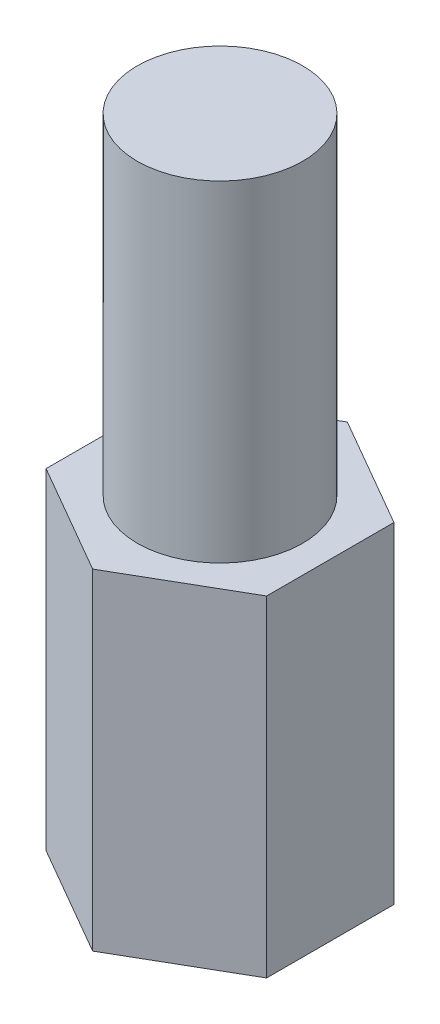
ISO-10303-21;
HEADER;
FILE_DESCRIPTION(('STEP AP214'),'2;1');
FILE_NAME('part.step','',(''),(''),'','','');
FILE_SCHEMA(('AUTOMOTIVE_DESIGN { 1 0 10303 214 1 1 1 1 }'));
ENDSEC;
DATA;
#1=APPLICATION_CONTEXT('core data for automotive mechanical design processes');
#2=APPLICATION_PROTOCOL_DEFINITION('international standard','automotive_design',2000,#1);
#3=PRODUCT_CONTEXT('',#1,'mechanical');
#4=PRODUCT('Part','Part','',(#3));
#5=PRODUCT_RELATED_PRODUCT_CATEGORY('part','',(#4));
#6=PRODUCT_DEFINITION_FORMATION('','',#4);
#7=PRODUCT_DEFINITION_CONTEXT('part definition',#1,'design');
#8=PRODUCT_DEFINITION('design','',#6,#7);
#9=PRODUCT_DEFINITION_SHAPE('','',#8);
#10=(LENGTH_UNIT() NAMED_UNIT(*) SI_UNIT(.MILLI.,.METRE.));
#11=(NAMED_UNIT(*) PLANE_ANGLE_UNIT() SI_UNIT($,.RADIAN.));
#12=(NAMED_UNIT(*) SI_UNIT($,.STERADIAN.) SOLID_ANGLE_UNIT());
#13=UNCERTAINTY_MEASURE_WITH_UNIT(LENGTH_MEASURE(1.E-05),#10,'distance_accuracy_value','');
#14=(GEOMETRIC_REPRESENTATION_CONTEXT(3) GLOBAL_UNCERTAINTY_ASSIGNED_CONTEXT((#13)) GLOBAL_UNIT_ASSIGNED_CONTEXT((#10,
#11,#12)) REPRESENTATION_CONTEXT('',''));
#15=CARTESIAN_POINT('',(0.,0.,0.));
#16=DIRECTION('',(0.,0.,1.));
#17=DIRECTION('',(1.,0.,0.));
#18=AXIS2_PLACEMENT_3D('',#15,#16,#17);
#19=CARTESIAN_POINT('',(0.,6.,0.));
#20=DIRECTION('',(0.,-1.,0.));
#21=DIRECTION('',(0.,0.,-1.));
#22=AXIS2_PLACEMENT_3D('',#19,#20,#21);
#23=CYLINDRICAL_SURFACE('',#22,1.5);
#24=CARTESIAN_POINT('',(0.,0.,0.));
#25=DIRECTION('',(0.,1.,0.));
#26=DIRECTION('',(0.,0.,1.));
#27=AXIS2_PLACEMENT_3D('',#24,#25,#26);
#28=CIRCLE('',#27,1.5);
#29=CARTESIAN_POINT('',(0.,0.,1.5));
#30=VERTEX_POINT('',#29);
#31=EDGE_CURVE('E234',#30,#30,#28,.T.);
#32=ORIENTED_EDGE('',*,*,#31,.F.);
#33=EDGE_LOOP('',(#32));
#34=FACE_BOUND('',#33,.T.);
#35=CARTESIAN_POINT('',(0.,4.,0.));
#36=DIRECTION('',(0.,1.,0.));
#37=DIRECTION('',(0.,0.,1.));
#38=AXIS2_PLACEMENT_3D('',#35,#36,#37);
#39=CIRCLE('',#38,1.5);
#40=CARTESIAN_POINT('',(0.,4.,1.5));
#41=VERTEX_POINT('',#40);
#42=EDGE_CURVE('E231',#41,#41,#39,.T.);
#43=ORIENTED_EDGE('',*,*,#42,.T.);
#44=EDGE_LOOP('',(#43));
#45=FACE_BOUND('',#44,.T.);
#46=ADVANCED_FACE('F35',(#34,#45),#23,.F.);
#47=CARTESIAN_POINT('',(0.,6.,0.));
#48=DIRECTION('',(0.,1.,0.));
#49=DIRECTION('',(0.,0.,1.));
#50=AXIS2_PLACEMENT_3D('',#47,#48,#49);
#51=PLANE('',#50);
#52=DIRECTION('',(-0.866025403784439,0.,-0.5));
#53=VECTOR('',#52,1.);
#54=CARTESIAN_POINT('',(2.,6.,-1.15470053837925));
#55=LINE('',#54,#53);
#56=CARTESIAN_POINT('',(2.,6.,-1.15470053837925));
#57=VERTEX_POINT('',#56);
#58=CARTESIAN_POINT('',(0.,6.,-2.3094010767585));
#59=VERTEX_POINT('',#58);
#60=EDGE_CURVE('E132',#57,#59,#55,.T.);
#61=ORIENTED_EDGE('',*,*,#60,.T.);
#62=DIRECTION('',(-0.866025403784438,0.,0.500000000000001));
#63=VECTOR('',#62,1.);
#64=CARTESIAN_POINT('',(0.,6.,-2.3094010767585));
#65=LINE('',#64,#63);
#66=CARTESIAN_POINT('',(-2.,6.,-1.15470053837925));
#67=VERTEX_POINT('',#66);
#68=EDGE_CURVE('E89',#59,#67,#65,.T.);
#69=ORIENTED_EDGE('',*,*,#68,.T.);
#70=DIRECTION('',(0.,0.,1.));
#71=VECTOR('',#70,1.);
#72=CARTESIAN_POINT('',(-2.,6.,-1.15470053837925));
#73=LINE('',#72,#71);
#74=CARTESIAN_POINT('',(-2.,6.,1.15470053837925));
#75=VERTEX_POINT('',#74);
#76=EDGE_CURVE('E103',#67,#75,#73,.T.);
#77=ORIENTED_EDGE('',*,*,#76,.T.);
#78=DIRECTION('',(0.866025403784439,0.,0.5));
#79=VECTOR('',#78,1.);
#80=CARTESIAN_POINT('',(-2.,6.,1.15470053837925));
#81=LINE('',#80,#79);
#82=CARTESIAN_POINT('',(0.,6.,2.3094010767585));
#83=VERTEX_POINT('',#82);
#84=EDGE_CURVE('E96',#75,#83,#81,.T.);
#85=ORIENTED_EDGE('',*,*,#84,.T.);
#86=DIRECTION('',(0.866025403784439,0.,-0.5));
#87=VECTOR('',#86,1.);
#88=CARTESIAN_POINT('',(0.,6.,2.3094010767585));
#89=LINE('',#88,#87);
#90=CARTESIAN_POINT('',(2.,6.,1.15470053837925));
#91=VERTEX_POINT('',#90);
#92=EDGE_CURVE('E101',#83,#91,#89,.T.);
#93=ORIENTED_EDGE('',*,*,#92,.T.);
#94=DIRECTION('',(0.,0.,-1.));
#95=VECTOR('',#94,1.);
#96=CARTESIAN_POINT('',(2.,6.,1.15470053837925));
#97=LINE('',#96,#95);
#98=EDGE_CURVE('E52',#91,#57,#97,.T.);
#99=ORIENTED_EDGE('',*,*,#98,.T.);
#100=EDGE_LOOP('',(#61,#69,#77,#85,#93,#99));
#101=FACE_BOUND('',#100,.T.);
#102=CARTESIAN_POINT('',(0.,6.,0.));
#103=DIRECTION('',(0.,1.,0.));
#104=DIRECTION('',(0.,0.,1.));
#105=AXIS2_PLACEMENT_3D('',#102,#103,#104);
#106=CIRCLE('',#105,1.5);
#107=CARTESIAN_POINT('',(0.,6.,1.5));
#108=VERTEX_POINT('',#107);
#109=EDGE_CURVE('E125',#108,#108,#106,.T.);
#110=ORIENTED_EDGE('',*,*,#109,.F.);
#111=EDGE_LOOP('',(#110));
#112=FACE_BOUND('',#111,.T.);
#113=ADVANCED_FACE('F98',(#101,#112),#51,.T.);
#114=CARTESIAN_POINT('',(0.,0.,0.));
#115=DIRECTION('',(0.,1.,0.));
#116=DIRECTION('',(0.,0.,1.));
#117=AXIS2_PLACEMENT_3D('',#114,#115,#116);
#118=PLANE('',#117);
#119=DIRECTION('',(-0.866025403784439,0.,-0.5));
#120=VECTOR('',#119,1.);
#121=CARTESIAN_POINT('',(2.,0.,-1.15470053837925));
#122=LINE('',#121,#120);
#123=CARTESIAN_POINT('',(2.,0.,-1.15470053837925));
#124=VERTEX_POINT('',#123);
#125=CARTESIAN_POINT('',(0.,0.,-2.3094010767585));
#126=VERTEX_POINT('',#125);
#127=EDGE_CURVE('E121',#124,#126,#122,.T.);
#128=ORIENTED_EDGE('',*,*,#127,.F.);
#129=DIRECTION('',(0.,0.,-1.));
#130=VECTOR('',#129,1.);
#131=CARTESIAN_POINT('',(2.,0.,1.15470053837925));
#132=LINE('',#131,#130);
#133=CARTESIAN_POINT('',(2.,0.,1.15470053837925));
#134=VERTEX_POINT('',#133);
#135=EDGE_CURVE('E81',#134,#124,#132,.T.);
#136=ORIENTED_EDGE('',*,*,#135,.F.);
#137=DIRECTION('',(0.866025403784439,0.,-0.5));
#138=VECTOR('',#137,1.);
#139=CARTESIAN_POINT('',(0.,0.,2.3094010767585));
#140=LINE('',#139,#138);
#141=CARTESIAN_POINT('',(0.,0.,2.3094010767585));
#142=VERTEX_POINT('',#141);
#143=EDGE_CURVE('E75',#142,#134,#140,.T.);
#144=ORIENTED_EDGE('',*,*,#143,.F.);
#145=DIRECTION('',(0.866025403784439,0.,0.5));
#146=VECTOR('',#145,1.);
#147=CARTESIAN_POINT('',(-2.,0.,1.15470053837925));
#148=LINE('',#147,#146);
#149=CARTESIAN_POINT('',(-2.,0.,1.15470053837925));
#150=VERTEX_POINT('',#149);
#151=EDGE_CURVE('E111',#150,#142,#148,.T.);
#152=ORIENTED_EDGE('',*,*,#151,.F.);
#153=DIRECTION('',(0.,0.,1.));
#154=VECTOR('',#153,1.);
#155=CARTESIAN_POINT('',(-2.,0.,-1.15470053837925));
#156=LINE('',#155,#154);
#157=CARTESIAN_POINT('',(-2.,0.,-1.15470053837925));
#158=VERTEX_POINT('',#157);
#159=EDGE_CURVE('E127',#158,#150,#156,.T.);
#160=ORIENTED_EDGE('',*,*,#159,.F.);
#161=DIRECTION('',(-0.866025403784438,0.,0.500000000000001));
#162=VECTOR('',#161,1.);
#163=CARTESIAN_POINT('',(0.,0.,-2.3094010767585));
#164=LINE('',#163,#162);
#165=EDGE_CURVE('E124',#126,#158,#164,.T.);
#166=ORIENTED_EDGE('',*,*,#165,.F.);
#167=EDGE_LOOP('',(#128,#136,#144,#152,#160,#166));
#168=FACE_BOUND('',#167,.T.);
#169=ORIENTED_EDGE('',*,*,#31,.T.);
#170=EDGE_LOOP('',(#169));
#171=FACE_BOUND('',#170,.T.);
#172=ADVANCED_FACE('F141',(#168,#171),#118,.F.);
#173=CARTESIAN_POINT('',(2.,6.,-1.15470053837925));
#174=DIRECTION('',(-0.5,0.,0.866025403784439));
#175=DIRECTION('',(0.866025403784439,0.,0.5));
#176=AXIS2_PLACEMENT_3D('',#173,#174,#175);
#177=PLANE('',#176);
#178=ORIENTED_EDGE('',*,*,#127,.T.);
#179=DIRECTION('',(0.,-1.,0.));
#180=VECTOR('',#179,1.);
#181=CARTESIAN_POINT('',(0.,6.,-2.3094010767585));
#182=LINE('',#181,#180);
#183=EDGE_CURVE('E11',#59,#126,#182,.T.);
#184=ORIENTED_EDGE('',*,*,#183,.F.);
#185=ORIENTED_EDGE('',*,*,#60,.F.);
#186=DIRECTION('',(0.,-1.,0.));
#187=VECTOR('',#186,1.);
#188=CARTESIAN_POINT('',(2.,6.,-1.15470053837925));
#189=LINE('',#188,#187);
#190=EDGE_CURVE('E117',#57,#124,#189,.T.);
#191=ORIENTED_EDGE('',*,*,#190,.T.);
#192=EDGE_LOOP('',(#178,#184,#185,#191));
#193=FACE_BOUND('',#192,.T.);
#194=ADVANCED_FACE('F37',(#193),#177,.F.);
#195=CARTESIAN_POINT('',(0.,6.,-2.3094010767585));
#196=DIRECTION('',(0.500000000000001,0.,0.866025403784438));
#197=DIRECTION('',(0.866025403784438,0.,-0.500000000000001));
#198=AXIS2_PLACEMENT_3D('',#195,#196,#197);
#199=PLANE('',#198);
#200=ORIENTED_EDGE('',*,*,#165,.T.);
#201=DIRECTION('',(0.,-1.,0.));
#202=VECTOR('',#201,1.);
#203=CARTESIAN_POINT('',(-2.,6.,-1.15470053837925));
#204=LINE('',#203,#202);
#205=EDGE_CURVE('E44',#67,#158,#204,.T.);
#206=ORIENTED_EDGE('',*,*,#205,.F.);
#207=ORIENTED_EDGE('',*,*,#68,.F.);
#208=ORIENTED_EDGE('',*,*,#183,.T.);
#209=EDGE_LOOP('',(#200,#206,#207,#208));
#210=FACE_BOUND('',#209,.T.);
#211=ADVANCED_FACE('F173',(#210),#199,.F.);
#212=CARTESIAN_POINT('',(-2.,6.,-1.15470053837925));
#213=DIRECTION('',(1.,0.,0.));
#214=DIRECTION('',(0.,0.,-1.));
#215=AXIS2_PLACEMENT_3D('',#212,#213,#214);
#216=PLANE('',#215);
#217=ORIENTED_EDGE('',*,*,#159,.T.);
#218=DIRECTION('',(0.,-1.,0.));
#219=VECTOR('',#218,1.);
#220=CARTESIAN_POINT('',(-2.,6.,1.15470053837925));
#221=LINE('',#220,#219);
#222=EDGE_CURVE('E112',#75,#150,#221,.T.);
#223=ORIENTED_EDGE('',*,*,#222,.F.);
#224=ORIENTED_EDGE('',*,*,#76,.F.);
#225=ORIENTED_EDGE('',*,*,#205,.T.);
#226=EDGE_LOOP('',(#217,#223,#224,#225));
#227=FACE_BOUND('',#226,.T.);
#228=ADVANCED_FACE('F138',(#227),#216,.F.);
#229=CARTESIAN_POINT('',(-2.,6.,1.15470053837925));
#230=DIRECTION('',(0.5,0.,-0.866025403784439));
#231=DIRECTION('',(-0.866025403784439,0.,-0.5));
#232=AXIS2_PLACEMENT_3D('',#229,#230,#231);
#233=PLANE('',#232);
#234=ORIENTED_EDGE('',*,*,#151,.T.);
#235=DIRECTION('',(0.,-1.,0.));
#236=VECTOR('',#235,1.);
#237=CARTESIAN_POINT('',(0.,6.,2.3094010767585));
#238=LINE('',#237,#236);
#239=EDGE_CURVE('E108',#83,#142,#238,.T.);
#240=ORIENTED_EDGE('',*,*,#239,.F.);
#241=ORIENTED_EDGE('',*,*,#84,.F.);
#242=ORIENTED_EDGE('',*,*,#222,.T.);
#243=EDGE_LOOP('',(#234,#240,#241,#242));
#244=FACE_BOUND('',#243,.T.);
#245=ADVANCED_FACE('F109',(#244),#233,.F.);
#246=CARTESIAN_POINT('',(0.,6.,2.3094010767585));
#247=DIRECTION('',(-0.5,0.,-0.866025403784439));
#248=DIRECTION('',(-0.866025403784439,0.,0.5));
#249=AXIS2_PLACEMENT_3D('',#246,#247,#248);
#250=PLANE('',#249);
#251=ORIENTED_EDGE('',*,*,#143,.T.);
#252=DIRECTION('',(0.,-1.,0.));
#253=VECTOR('',#252,1.);
#254=CARTESIAN_POINT('',(2.,6.,1.15470053837925));
#255=LINE('',#254,#253);
#256=EDGE_CURVE('E113',#91,#134,#255,.T.);
#257=ORIENTED_EDGE('',*,*,#256,.F.);
#258=ORIENTED_EDGE('',*,*,#92,.F.);
#259=ORIENTED_EDGE('',*,*,#239,.T.);
#260=EDGE_LOOP('',(#251,#257,#258,#259));
#261=FACE_BOUND('',#260,.T.);
#262=ADVANCED_FACE('F115',(#261),#250,.F.);
#263=CARTESIAN_POINT('',(2.,6.,1.15470053837925));
#264=DIRECTION('',(-1.,0.,0.));
#265=DIRECTION('',(0.,0.,1.));
#266=AXIS2_PLACEMENT_3D('',#263,#264,#265);
#267=PLANE('',#266);
#268=ORIENTED_EDGE('',*,*,#135,.T.);
#269=ORIENTED_EDGE('',*,*,#190,.F.);
#270=ORIENTED_EDGE('',*,*,#98,.F.);
#271=ORIENTED_EDGE('',*,*,#256,.T.);
#272=EDGE_LOOP('',(#268,#269,#270,#271));
#273=FACE_BOUND('',#272,.T.);
#274=ADVANCED_FACE('F146',(#273),#267,.F.);
#275=CARTESIAN_POINT('',(0.,4.,0.));
#276=DIRECTION('',(0.,1.,0.));
#277=DIRECTION('',(0.,0.,1.));
#278=AXIS2_PLACEMENT_3D('',#275,#276,#277);
#279=PLANE('',#278);
#280=ORIENTED_EDGE('',*,*,#42,.F.);
#281=EDGE_LOOP('',(#280));
#282=FACE_BOUND('',#281,.T.);
#283=ADVANCED_FACE('F148',(#282),#279,.F.);
#284=CARTESIAN_POINT('',(0.,4.,0.));
#285=DIRECTION('',(0.,1.,0.));
#286=DIRECTION('',(0.,0.,1.));
#287=AXIS2_PLACEMENT_3D('',#284,#285,#286);
#288=CYLINDRICAL_SURFACE('',#287,1.5);
#289=ORIENTED_EDGE('',*,*,#109,.T.);
#290=EDGE_LOOP('',(#289));
#291=FACE_BOUND('',#290,.T.);
#292=CARTESIAN_POINT('',(0.,12.,0.));
#293=DIRECTION('',(0.,1.,0.));
#294=DIRECTION('',(0.,0.,1.));
#295=AXIS2_PLACEMENT_3D('',#292,#293,#294);
#296=CIRCLE('',#295,1.5);
#297=CARTESIAN_POINT('',(0.,12.,1.5));
#298=VERTEX_POINT('',#297);
#299=EDGE_CURVE('E229',#298,#298,#296,.T.);
#300=ORIENTED_EDGE('',*,*,#299,.F.);
#301=EDGE_LOOP('',(#300));
#302=FACE_BOUND('',#301,.T.);
#303=ADVANCED_FACE('F154',(#291,#302),#288,.T.);
#304=CARTESIAN_POINT('',(0.,12.,0.));
#305=DIRECTION('',(0.,1.,0.));
#306=DIRECTION('',(0.,0.,1.));
#307=AXIS2_PLACEMENT_3D('',#304,#305,#306);
#308=PLANE('',#307);
#309=ORIENTED_EDGE('',*,*,#299,.T.);
#310=EDGE_LOOP('',(#309));
#311=FACE_BOUND('',#310,.T.);
#312=ADVANCED_FACE('F214',(#311),#308,.T.);
#313=CLOSED_SHELL('',(#46,#113,#172,#194,#211,#228,#245,#262,#274,#283,#303,#312));
#314=MANIFOLD_SOLID_BREP('B2',#313);
#315=ADVANCED_BREP_SHAPE_REPRESENTATION('',(#18,#314),#14);
#316=SHAPE_DEFINITION_REPRESENTATION(#9,#315);
ENDSEC;
END-ISO-10303-21;
